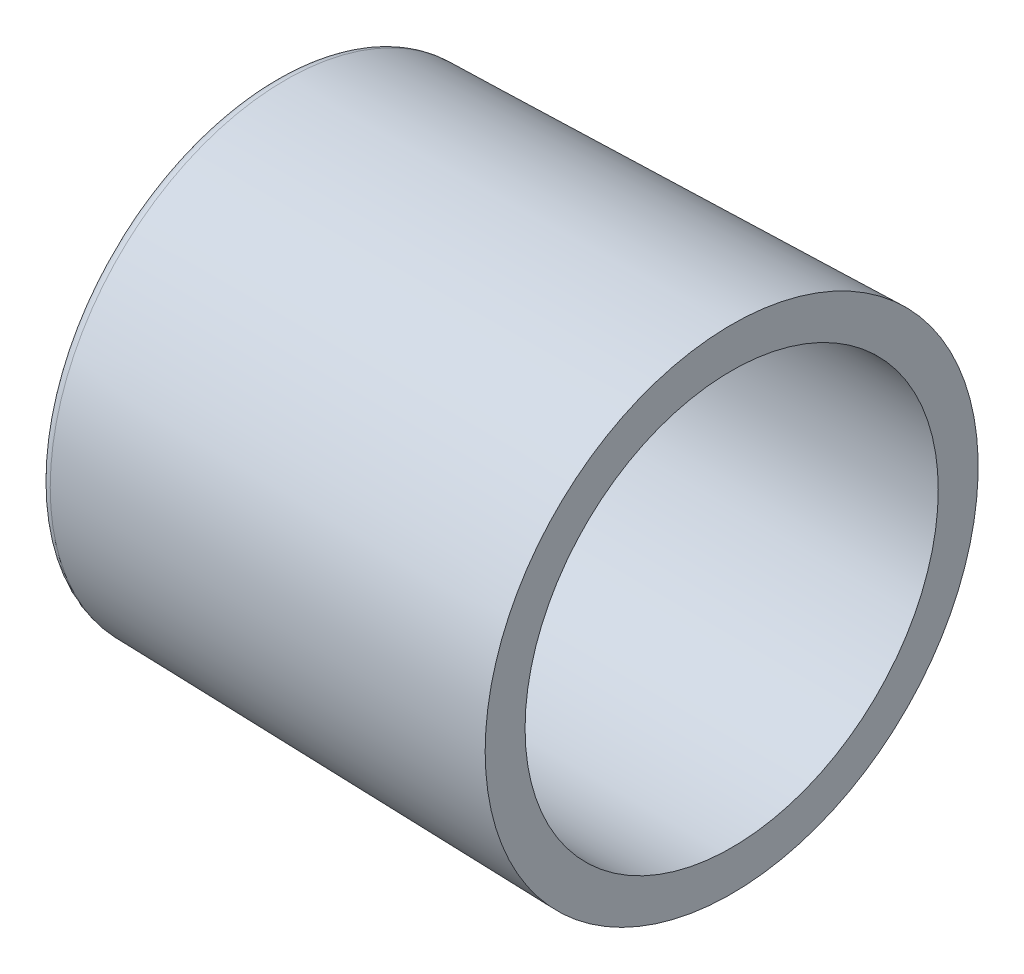
ISO-10303-21;
HEADER;
FILE_DESCRIPTION(('STEP AP214'),'2;1');
FILE_NAME('part.step','',(''),(''),'','','');
FILE_SCHEMA(('AUTOMOTIVE_DESIGN { 1 0 10303 214 1 1 1 1 }'));
ENDSEC;
DATA;
#1=APPLICATION_CONTEXT('core data for automotive mechanical design processes');
#2=APPLICATION_PROTOCOL_DEFINITION('international standard','automotive_design',2000,#1);
#3=PRODUCT_CONTEXT('',#1,'mechanical');
#4=PRODUCT('Part','Part','',(#3));
#5=PRODUCT_RELATED_PRODUCT_CATEGORY('part','',(#4));
#6=PRODUCT_DEFINITION_FORMATION('','',#4);
#7=PRODUCT_DEFINITION_CONTEXT('part definition',#1,'design');
#8=PRODUCT_DEFINITION('design','',#6,#7);
#9=PRODUCT_DEFINITION_SHAPE('','',#8);
#10=(LENGTH_UNIT() NAMED_UNIT(*) SI_UNIT(.MILLI.,.METRE.));
#11=(NAMED_UNIT(*) PLANE_ANGLE_UNIT() SI_UNIT($,.RADIAN.));
#12=(NAMED_UNIT(*) SI_UNIT($,.STERADIAN.) SOLID_ANGLE_UNIT());
#13=UNCERTAINTY_MEASURE_WITH_UNIT(LENGTH_MEASURE(1.E-05),#10,'distance_accuracy_value','');
#14=(GEOMETRIC_REPRESENTATION_CONTEXT(3) GLOBAL_UNCERTAINTY_ASSIGNED_CONTEXT((#13)) GLOBAL_UNIT_ASSIGNED_CONTEXT((#10,
#11,#12)) REPRESENTATION_CONTEXT('',''));
#15=CARTESIAN_POINT('',(0.,0.,0.));
#16=DIRECTION('',(0.,0.,1.));
#17=DIRECTION('',(1.,0.,0.));
#18=AXIS2_PLACEMENT_3D('',#15,#16,#17);
#19=CARTESIAN_POINT('',(-14.5,0.,0.));
#20=DIRECTION('',(-1.,0.,0.));
#21=DIRECTION('',(0.,0.,1.));
#22=AXIS2_PLACEMENT_3D('',#19,#20,#21);
#23=TOROIDAL_SURFACE('',#22,10.3223437744064,0.499999999999999);
#24=CARTESIAN_POINT('',(-15.,0.,0.));
#25=DIRECTION('',(-1.,0.,0.));
#26=DIRECTION('',(0.,0.,1.));
#27=AXIS2_PLACEMENT_3D('',#24,#25,#26);
#28=CIRCLE('',#27,10.3223437744064);
#29=CARTESIAN_POINT('',(-15.,0.,10.3223437744064));
#30=VERTEX_POINT('',#29);
#31=EDGE_CURVE('E42',#30,#30,#28,.T.);
#32=ORIENTED_EDGE('',*,*,#31,.F.);
#33=EDGE_LOOP('',(#32));
#34=FACE_BOUND('',#33,.T.);
#35=CARTESIAN_POINT('',(-14.5124960955801,0.,0.));
#36=DIRECTION('',(-1.,0.,0.));
#37=DIRECTION('',(0.,0.,1.));
#38=AXIS2_PLACEMENT_3D('',#35,#36,#37);
#39=CIRCLE('',#38,10.8221875976105);
#40=CARTESIAN_POINT('',(-14.5124960955801,0.,10.8221875976105));
#41=VERTEX_POINT('',#40);
#42=EDGE_CURVE('E51',#41,#41,#39,.T.);
#43=ORIENTED_EDGE('',*,*,#42,.T.);
#44=EDGE_LOOP('',(#43));
#45=FACE_BOUND('',#44,.T.);
#46=ADVANCED_FACE('F31',(#34,#45),#23,.T.);
#47=CARTESIAN_POINT('',(6.,-10.3223437744064,0.));
#48=DIRECTION('',(-1.,0.,0.));
#49=DIRECTION('',(0.,0.,1.));
#50=AXIS2_PLACEMENT_3D('',#47,#48,#49);
#51=PLANE('',#50);
#52=CARTESIAN_POINT('',(6.,0.,0.));
#53=DIRECTION('',(-1.,0.,0.));
#54=DIRECTION('',(0.,0.,1.));
#55=AXIS2_PLACEMENT_3D('',#52,#53,#54);
#56=CIRCLE('',#55,11.335);
#57=CARTESIAN_POINT('',(6.,0.,11.335));
#58=VERTEX_POINT('',#57);
#59=EDGE_CURVE('E46',#58,#58,#56,.T.);
#60=ORIENTED_EDGE('',*,*,#59,.F.);
#61=EDGE_LOOP('',(#60));
#62=FACE_BOUND('',#61,.T.);
#63=CARTESIAN_POINT('',(6.,0.,0.));
#64=DIRECTION('',(1.,0.,0.));
#65=DIRECTION('',(0.,0.,-1.));
#66=AXIS2_PLACEMENT_3D('',#63,#64,#65);
#67=CIRCLE('',#66,9.5);
#68=CARTESIAN_POINT('',(6.,0.,-9.5));
#69=VERTEX_POINT('',#68);
#70=EDGE_CURVE('E54',#69,#69,#67,.T.);
#71=ORIENTED_EDGE('',*,*,#70,.F.);
#72=EDGE_LOOP('',(#71));
#73=FACE_BOUND('',#72,.T.);
#74=ADVANCED_FACE('F60',(#62,#73),#51,.F.);
#75=CARTESIAN_POINT('',(6.,0.,0.));
#76=DIRECTION('',(1.,0.,0.));
#77=DIRECTION('',(0.,0.,-1.));
#78=AXIS2_PLACEMENT_3D('',#75,#76,#77);
#79=CONICAL_SURFACE('',#78,11.335,0.0249947936189204);
#80=ORIENTED_EDGE('',*,*,#42,.F.);
#81=EDGE_LOOP('',(#80));
#82=FACE_BOUND('',#81,.T.);
#83=ORIENTED_EDGE('',*,*,#59,.T.);
#84=EDGE_LOOP('',(#83));
#85=FACE_BOUND('',#84,.T.);
#86=ADVANCED_FACE('F62',(#82,#85),#79,.T.);
#87=CARTESIAN_POINT('',(-44.1959971224861,0.,0.));
#88=DIRECTION('',(1.,0.,0.));
#89=DIRECTION('',(0.,0.,-1.));
#90=AXIS2_PLACEMENT_3D('',#87,#88,#89);
#91=CYLINDRICAL_SURFACE('',#90,9.5);
#92=CARTESIAN_POINT('',(-14.5,0.,0.));
#93=DIRECTION('',(1.,0.,0.));
#94=DIRECTION('',(0.,0.,-1.));
#95=AXIS2_PLACEMENT_3D('',#92,#93,#94);
#96=CIRCLE('',#95,9.5);
#97=CARTESIAN_POINT('',(-14.5,0.,-9.5));
#98=VERTEX_POINT('',#97);
#99=EDGE_CURVE('E38',#98,#98,#96,.F.);
#100=ORIENTED_EDGE('',*,*,#99,.T.);
#101=EDGE_LOOP('',(#100));
#102=FACE_BOUND('',#101,.T.);
#103=ORIENTED_EDGE('',*,*,#70,.T.);
#104=EDGE_LOOP('',(#103));
#105=FACE_BOUND('',#104,.T.);
#106=ADVANCED_FACE('F58',(#102,#105),#91,.F.);
#107=CARTESIAN_POINT('',(-15.,0.,0.));
#108=DIRECTION('',(1.,0.,0.));
#109=DIRECTION('',(0.,0.,-1.));
#110=AXIS2_PLACEMENT_3D('',#107,#108,#109);
#111=PLANE('',#110);
#112=CARTESIAN_POINT('',(-15.,0.,0.));
#113=DIRECTION('',(1.,0.,0.));
#114=DIRECTION('',(0.,0.,-1.));
#115=AXIS2_PLACEMENT_3D('',#112,#113,#114);
#116=CIRCLE('',#115,10.);
#117=CARTESIAN_POINT('',(-15.,0.,-10.));
#118=VERTEX_POINT('',#117);
#119=EDGE_CURVE('E10',#118,#118,#116,.T.);
#120=ORIENTED_EDGE('',*,*,#119,.T.);
#121=EDGE_LOOP('',(#120));
#122=FACE_BOUND('',#121,.T.);
#123=ORIENTED_EDGE('',*,*,#31,.T.);
#124=EDGE_LOOP('',(#123));
#125=FACE_BOUND('',#124,.T.);
#126=ADVANCED_FACE('F76',(#122,#125),#111,.F.);
#127=CARTESIAN_POINT('',(-14.5,0.,0.));
#128=DIRECTION('',(1.,0.,0.));
#129=DIRECTION('',(0.,0.,-1.));
#130=AXIS2_PLACEMENT_3D('',#127,#128,#129);
#131=TOROIDAL_SURFACE('',#130,10.,0.5);
#132=ORIENTED_EDGE('',*,*,#119,.F.);
#133=EDGE_LOOP('',(#132));
#134=FACE_BOUND('',#133,.T.);
#135=ORIENTED_EDGE('',*,*,#99,.F.);
#136=EDGE_LOOP('',(#135));
#137=FACE_BOUND('',#136,.T.);
#138=ADVANCED_FACE('F33',(#134,#137),#131,.T.);
#139=CLOSED_SHELL('',(#46,#74,#86,#106,#126,#138));
#140=MANIFOLD_SOLID_BREP('B2',#139);
#141=ADVANCED_BREP_SHAPE_REPRESENTATION('',(#18,#140),#14);
#142=SHAPE_DEFINITION_REPRESENTATION(#9,#141);
ENDSEC;
END-ISO-10303-21;
